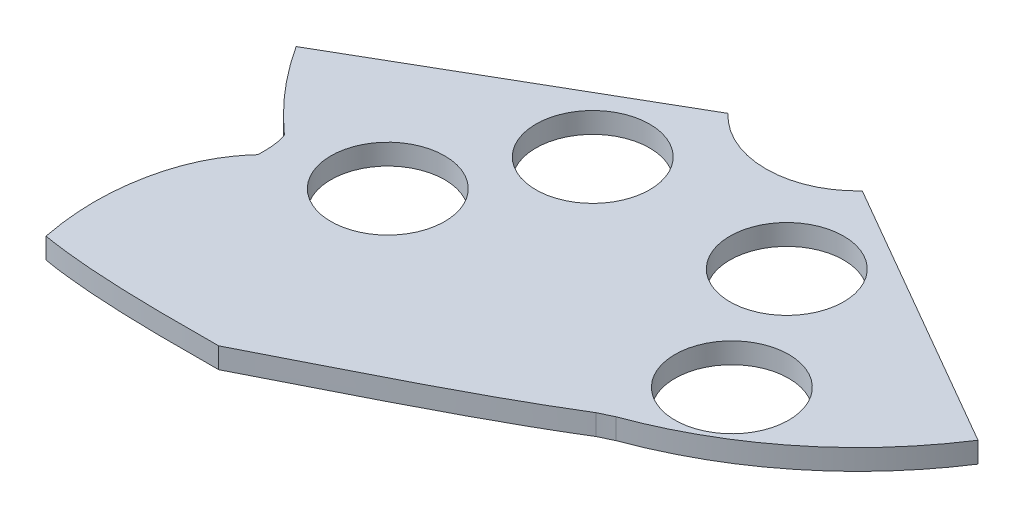
ISO-10303-21;
HEADER;
FILE_DESCRIPTION(('STEP AP214'),'2;1');
FILE_NAME('part.step','',(''),(''),'','','');
FILE_SCHEMA(('AUTOMOTIVE_DESIGN { 1 0 10303 214 1 1 1 1 }'));
ENDSEC;
DATA;
#1=APPLICATION_CONTEXT('core data for automotive mechanical design processes');
#2=APPLICATION_PROTOCOL_DEFINITION('international standard','automotive_design',2000,#1);
#3=PRODUCT_CONTEXT('',#1,'mechanical');
#4=PRODUCT('Part','Part','',(#3));
#5=PRODUCT_RELATED_PRODUCT_CATEGORY('part','',(#4));
#6=PRODUCT_DEFINITION_FORMATION('','',#4);
#7=PRODUCT_DEFINITION_CONTEXT('part definition',#1,'design');
#8=PRODUCT_DEFINITION('design','',#6,#7);
#9=PRODUCT_DEFINITION_SHAPE('','',#8);
#10=(LENGTH_UNIT() NAMED_UNIT(*) SI_UNIT(.MILLI.,.METRE.));
#11=(NAMED_UNIT(*) PLANE_ANGLE_UNIT() SI_UNIT($,.RADIAN.));
#12=(NAMED_UNIT(*) SI_UNIT($,.STERADIAN.) SOLID_ANGLE_UNIT());
#13=UNCERTAINTY_MEASURE_WITH_UNIT(LENGTH_MEASURE(1.E-05),#10,'distance_accuracy_value','');
#14=(GEOMETRIC_REPRESENTATION_CONTEXT(3) GLOBAL_UNCERTAINTY_ASSIGNED_CONTEXT((#13)) GLOBAL_UNIT_ASSIGNED_CONTEXT((#10,
#11,#12)) REPRESENTATION_CONTEXT('',''));
#15=CARTESIAN_POINT('',(0.,0.,0.));
#16=DIRECTION('',(0.,0.,1.));
#17=DIRECTION('',(1.,0.,0.));
#18=AXIS2_PLACEMENT_3D('',#15,#16,#17);
#19=CARTESIAN_POINT('',(-59.5908958473994,-99.736,51.0999248813994));
#20=DIRECTION('',(0.,-1.,0.));
#21=DIRECTION('',(0.,0.,-1.));
#22=AXIS2_PLACEMENT_3D('',#19,#20,#21);
#23=PLANE('',#22);
#24=CARTESIAN_POINT('',(18.75,-99.736,32.476));
#25=DIRECTION('',(0.,-1.,0.));
#26=DIRECTION('',(0.,0.,-1.));
#27=AXIS2_PLACEMENT_3D('',#24,#25,#26);
#28=CIRCLE('',#27,10.999845998306);
#29=CARTESIAN_POINT('',(18.75,-99.736,21.476154001694));
#30=VERTEX_POINT('',#29);
#31=EDGE_CURVE('E441',#30,#30,#28,.T.);
#32=ORIENTED_EDGE('',*,*,#31,.F.);
#33=EDGE_LOOP('',(#32));
#34=FACE_BOUND('',#33,.T.);
#35=CARTESIAN_POINT('',(-33.25,-99.736,57.591));
#36=DIRECTION('',(0.,-1.,0.));
#37=DIRECTION('',(0.,0.,-1.));
#38=AXIS2_PLACEMENT_3D('',#35,#36,#37);
#39=CIRCLE('',#38,10.999845998306);
#40=CARTESIAN_POINT('',(-33.25,-99.736,46.591154001694));
#41=VERTEX_POINT('',#40);
#42=EDGE_CURVE('E422',#41,#41,#39,.T.);
#43=ORIENTED_EDGE('',*,*,#42,.F.);
#44=EDGE_LOOP('',(#43));
#45=FACE_BOUND('',#44,.T.);
#46=CARTESIAN_POINT('',(-65.8942438215737,-99.736,42.6629141284688));
#47=CARTESIAN_POINT('',(-63.9840039596371,-99.736,45.6122875914085));
#48=CARTESIAN_POINT('',(-61.8778196203562,-99.736,48.4335551152774));
#49=CARTESIAN_POINT('',(-57.3039784403234,-99.736,53.7662872254148));
#50=CARTESIAN_POINT('',(-54.8369437876609,-99.736,56.2801089870337));
#51=CARTESIAN_POINT('',(-52.2139292092429,-99.736,58.6170428831987));
#52=B_SPLINE_CURVE_WITH_KNOTS('',3,(#46,#47,#48,#49,#50,#51),.UNSPECIFIED.,.F.,.F.,(4,2,4),
(1.39179995728433E-06,0.500001391799957,1.),.UNSPECIFIED.);
#53=CARTESIAN_POINT('',(-52.2139292141759,-99.736,58.6170428887357));
#54=VERTEX_POINT('',#53);
#55=CARTESIAN_POINT('',(-65.8942438215737,-99.736,42.6629141284688));
#56=VERTEX_POINT('',#55);
#57=EDGE_CURVE('E378',#54,#56,#52,.F.);
#58=ORIENTED_EDGE('',*,*,#57,.T.);
#59=DIRECTION('',(0.866025113443952,0.,-0.500000502884137));
#60=VECTOR('',#59,1.);
#61=CARTESIAN_POINT('',(-65.8942438215737,-99.736,42.6629141284688));
#62=LINE('',#61,#60);
#63=CARTESIAN_POINT('',(-12.9766531358799,-99.736,12.1108879302399));
#64=VERTEX_POINT('',#63);
#65=EDGE_CURVE('E103',#56,#64,#62,.T.);
#66=ORIENTED_EDGE('',*,*,#65,.T.);
#67=CARTESIAN_POINT('',(0.,-99.736,0.));
#68=DIRECTION('',(0.,1.,0.));
#69=DIRECTION('',(0.,0.,-1.));
#70=AXIS2_PLACEMENT_3D('',#67,#68,#69);
#71=CIRCLE('',#70,17.7501305084715);
#72=CARTESIAN_POINT('',(12.9766531358511,-99.736,12.1108879302707));
#73=VERTEX_POINT('',#72);
#74=EDGE_CURVE('E272',#64,#73,#71,.T.);
#75=ORIENTED_EDGE('',*,*,#74,.T.);
#76=DIRECTION('',(0.866025113442765,0.,0.500000502886193));
#77=VECTOR('',#76,1.);
#78=CARTESIAN_POINT('',(12.9766531358511,-99.736,12.1108879302707));
#79=LINE('',#78,#77);
#80=CARTESIAN_POINT('',(65.8946490574718,-99.736,42.6631480920524));
#81=VERTEX_POINT('',#80);
#82=EDGE_CURVE('E249',#73,#81,#79,.T.);
#83=ORIENTED_EDGE('',*,*,#82,.T.);
#84=CARTESIAN_POINT('',(26.9623093718119,-99.736,73.7247949113876));
#85=CARTESIAN_POINT('',(30.9290383355364,-99.736,72.2744827832804));
#86=CARTESIAN_POINT('',(34.774905800181,-99.736,70.5032364463664));
#87=CARTESIAN_POINT('',(40.3009419819919,-99.736,67.3976495532651));
#88=CARTESIAN_POINT('',(42.0999932076313,-99.736,66.2898834281091));
#89=CARTESIAN_POINT('',(45.6012748301672,-99.736,63.9313792779829));
#90=CARTESIAN_POINT('',(47.3055701881919,-99.736,62.6798674808376));
#91=CARTESIAN_POINT('',(52.2596052139985,-99.736,58.7281530850985));
#92=CARTESIAN_POINT('',(55.3477771990305,-99.736,55.8285573460401));
#93=CARTESIAN_POINT('',(61.0180676571082,-99.736,49.5686140032875));
#94=CARTESIAN_POINT('',(63.5993686540043,-99.736,46.2085982513747));
#95=CARTESIAN_POINT('',(65.8946490574718,-99.736,42.6631480920524));
#96=B_SPLINE_CURVE_WITH_KNOTS('',3,(#84,#85,#86,#87,#88,#89,#90,#91,#92,#93,#94,#95),
.UNSPECIFIED.,.F.,.F.,(4,2,2,2,2,4),(0.,0.250000000000001,0.375,0.5,0.75,1.),.UNSPECIFIED.);
#97=CARTESIAN_POINT('',(26.9623093718119,-99.736,73.7247949113876));
#98=VERTEX_POINT('',#97);
#99=EDGE_CURVE('E244',#81,#98,#96,.F.);
#100=ORIENTED_EDGE('',*,*,#99,.T.);
#101=CARTESIAN_POINT('',(24.3635474099013,-99.736,74.9703640030378));
#102=CARTESIAN_POINT('',(24.504895258871,-99.736,74.8957933395371));
#103=CARTESIAN_POINT('',(24.7885054477501,-99.736,74.7461721234199));
#104=CARTESIAN_POINT('',(25.2202238778301,-99.736,74.5299119746692));
#105=CARTESIAN_POINT('',(25.7310374353915,-99.736,74.2826548361469));
#106=CARTESIAN_POINT('',(26.311602051326,-99.736,74.0127331890676));
#107=CARTESIAN_POINT('',(26.7487449389081,-99.736,73.8192972281379));
#108=CARTESIAN_POINT('',(26.9623086079489,-99.736,73.7247951906713));
#109=B_SPLINE_CURVE_WITH_KNOTS('',3,(#101,#102,#103,#104,#105,#106,#107,#108),.UNSPECIFIED.,.F.,
.F.,(4,1,1,1,1,4),(0.,0.166302308320952,0.333679330924301,0.502441424578362,0.756863165490183,
0.999887722188058),.UNSPECIFIED.);
#110=CARTESIAN_POINT('',(24.3635474099013,-99.736,74.9703640030378));
#111=VERTEX_POINT('',#110);
#112=EDGE_CURVE('E321',#98,#111,#109,.F.);
#113=ORIENTED_EDGE('',*,*,#112,.T.);
#114=CARTESIAN_POINT('',(-23.2826883139584,-99.736,100.239789279672));
#115=CARTESIAN_POINT('',(-22.4064800124137,-99.736,99.7924462503326));
#116=CARTESIAN_POINT('',(-20.6372377731749,-99.736,98.8891699614171));
#117=CARTESIAN_POINT('',(-15.4675726686189,-99.736,96.2742080454189));
#118=CARTESIAN_POINT('',(-7.71690180073564,-99.736,92.3907939135846));
#119=CARTESIAN_POINT('',(0.69025250496672,-99.736,88.1133323119624));
#120=CARTESIAN_POINT('',(7.50120204387223,-99.736,84.5367741734257));
#121=CARTESIAN_POINT('',(12.5650779158545,-99.736,81.8042095762084));
#122=CARTESIAN_POINT('',(17.7115577630885,-99.736,78.9204102346819));
#123=CARTESIAN_POINT('',(21.3026007906839,-99.736,76.8187696134885));
#124=CARTESIAN_POINT('',(23.5091899984885,-99.736,75.4903709563967));
#125=CARTESIAN_POINT('',(24.0767304185092,-99.736,75.1449357918904));
#126=CARTESIAN_POINT('',(24.3635474098919,-99.736,74.9703640030223));
#127=B_SPLINE_CURVE_WITH_KNOTS('',3,(#114,#115,#116,#117,#118,#119,#120,#121,#122,#123,#124,
#125,#126),.UNSPECIFIED.,.F.,.F.,(4,1,1,1,1,1,1,1,1,1,4),(-4.3701811903718E-06,
0.0547045458955122,0.110464025307909,0.322165712591621,0.536796962772431,0.635003948080193,
0.749962478870649,0.856771583074697,0.96305276758821,0.981328042949346,1.00000000000009),.UNSPECIFIED.);
#128=CARTESIAN_POINT('',(-23.2826883139584,-99.736,100.239789279672));
#129=VERTEX_POINT('',#128);
#130=EDGE_CURVE('E129',#111,#129,#127,.F.);
#131=ORIENTED_EDGE('',*,*,#130,.T.);
#132=CARTESIAN_POINT('',(-1669.3169944597,-99.736,1229.30718692422));
#133=CARTESIAN_POINT('',(2148.0173222506,-99.736,-1018.92386345187));
#134=CARTESIAN_POINT('',(-2164.91270202674,-99.736,1202.26997164792));
#135=CARTESIAN_POINT('',(1624.65400079232,-99.736,-978.564595621602));
#136=B_SPLINE_CURVE_WITH_KNOTS('',3,(#132,#133,#134,#135),.UNSPECIFIED.,.F.,.F.,(4,4),
(-9.92121066633461,9.34593164522102),.UNSPECIFIED.);
#137=CARTESIAN_POINT('',(-58.3328550829168,-99.736,98.568820578961));
#138=VERTEX_POINT('',#137);
#139=EDGE_CURVE('E122',#129,#138,#136,.T.);
#140=ORIENTED_EDGE('',*,*,#139,.T.);
#141=CARTESIAN_POINT('',(-51.4906928753883,-99.736,64.4589689277213));
#142=CARTESIAN_POINT('',(-51.711723307029,-99.736,64.7046850204382));
#143=CARTESIAN_POINT('',(-52.1516151834694,-99.736,65.1937054728768));
#144=CARTESIAN_POINT('',(-52.7723949504336,-99.736,65.9552520868977));
#145=CARTESIAN_POINT('',(-53.3609545073442,-99.736,66.7313423761301));
#146=CARTESIAN_POINT('',(-53.9157163309975,-99.736,67.5235939872376));
#147=CARTESIAN_POINT('',(-54.7918608211576,-99.736,68.876753614916));
#148=CARTESIAN_POINT('',(-55.8834594583203,-99.736,70.8638801995351));
#149=CARTESIAN_POINT('',(-57.0165943997224,-99.736,73.5315666341852));
#150=CARTESIAN_POINT('',(-57.9094867293355,-99.736,76.3017585118482));
#151=CARTESIAN_POINT('',(-58.5775393006056,-99.736,79.1271095885574));
#152=CARTESIAN_POINT('',(-59.0517620475631,-99.736,82.0106522481691));
#153=CARTESIAN_POINT('',(-59.3372874543469,-99.736,84.8919464637603));
#154=CARTESIAN_POINT('',(-59.4406913737221,-99.736,87.7685229035063));
#155=CARTESIAN_POINT('',(-59.3718138200478,-99.736,90.6212286463738));
#156=CARTESIAN_POINT('',(-59.1789836962622,-99.736,92.9844425201729));
#157=CARTESIAN_POINT('',(-58.9503668066364,-99.736,94.8648753989335));
#158=CARTESIAN_POINT('',(-58.7711853577117,-99.736,96.0855047846796));
#159=CARTESIAN_POINT('',(-58.6047431822294,-99.736,97.0912677796519));
#160=CARTESIAN_POINT('',(-58.4687760228228,-99.736,97.8574149315629));
#161=CARTESIAN_POINT('',(-58.3764860521202,-99.736,98.3404575477575));
#162=CARTESIAN_POINT('',(-58.3328550830203,-99.736,98.5688205789807));
#163=B_SPLINE_CURVE_WITH_KNOTS('',3,(#141,#142,#143,#144,#145,#146,#147,#148,#149,#150,#151,
#152,#153,#154,#155,#156,#157,#158,#159,#160,#161,#162),.UNSPECIFIED.,.F.,.F.,(4,1,1,1,1,1,1,1,
1,1,1,1,1,1,1,1,1,1,1,4),(-1.10533804331681E-12,0.0275012446218071,0.0547325859144433,
0.0817350649508025,0.108546201435326,0.135200513378319,0.215871144837617,0.296834029909777,
0.376050589025834,0.457805083877822,0.538220215626806,0.619074716839881,0.698599870823023,
0.777615725570406,0.856414831682729,0.895814886594267,0.93524678276134,0.959074415855892,
0.980652341517551,1.00000057672125),.UNSPECIFIED.);
#164=CARTESIAN_POINT('',(-51.4906928753883,-99.736,64.4589689277213));
#165=VERTEX_POINT('',#164);
#166=EDGE_CURVE('E126',#138,#165,#163,.F.);
#167=ORIENTED_EDGE('',*,*,#166,.T.);
#168=CARTESIAN_POINT('',(-52.2139292141759,-99.736,58.6170428887357));
#169=CARTESIAN_POINT('',(-52.185700803631,-99.736,58.6919344999885));
#170=CARTESIAN_POINT('',(-52.1296231499672,-99.736,58.8407117693101));
#171=CARTESIAN_POINT('',(-52.0534037189861,-99.736,59.0650498919511));
#172=CARTESIAN_POINT('',(-51.9695236186869,-99.736,59.3327056988002));
#173=CARTESIAN_POINT('',(-51.8820387495496,-99.736,59.6478085092204));
#174=CARTESIAN_POINT('',(-51.7680242428427,-99.736,60.1272476442796));
#175=CARTESIAN_POINT('',(-51.6554178661394,-99.736,60.7426858067751));
#176=CARTESIAN_POINT('',(-51.5346083508011,-99.736,61.7360748328224));
#177=CARTESIAN_POINT('',(-51.4854390608135,-99.736,62.7429515755013));
#178=CARTESIAN_POINT('',(-51.4795640266868,-99.736,63.6157889502724));
#179=CARTESIAN_POINT('',(-51.4834906588835,-99.736,64.1044575689541));
#180=CARTESIAN_POINT('',(-51.4883312545796,-99.7359999999999,64.3427256906522));
#181=CARTESIAN_POINT('',(-51.4906928753883,-99.7359999999999,64.4589689277213));
#182=B_SPLINE_CURVE_WITH_KNOTS('',3,(#168,#169,#170,#171,#172,#173,#174,#175,#176,#177,#178,
#179,#180,#181),.UNSPECIFIED.,.F.,.F.,(4,1,1,1,1,1,1,1,1,1,1,4),(4.41350721547273E-06,
0.0405296757742124,0.08051059781494,0.119959931369552,0.182552622210914,0.246058623212267,
0.369457252362463,0.499123697640981,0.752552578421829,0.879323211881176,0.941125734758046,1.),.UNSPECIFIED.);
#183=EDGE_CURVE('E51',#165,#54,#182,.F.);
#184=ORIENTED_EDGE('',*,*,#183,.T.);
#185=EDGE_LOOP('',(#58,#66,#75,#83,#100,#113,#131,#140,#167,#184));
#186=FACE_BOUND('',#185,.T.);
#187=CARTESIAN_POINT('',(33.25,-99.736,57.591));
#188=DIRECTION('',(0.,-1.,0.));
#189=DIRECTION('',(0.,0.,-1.));
#190=AXIS2_PLACEMENT_3D('',#187,#188,#189);
#191=CIRCLE('',#190,10.999845998306);
#192=CARTESIAN_POINT('',(33.25,-99.736,46.591154001694));
#193=VERTEX_POINT('',#192);
#194=EDGE_CURVE('E429',#193,#193,#191,.T.);
#195=ORIENTED_EDGE('',*,*,#194,.F.);
#196=EDGE_LOOP('',(#195));
#197=FACE_BOUND('',#196,.T.);
#198=CARTESIAN_POINT('',(-18.75,-99.736,32.476));
#199=DIRECTION('',(0.,-1.,0.));
#200=DIRECTION('',(0.,0.,-1.));
#201=AXIS2_PLACEMENT_3D('',#198,#199,#200);
#202=CIRCLE('',#201,10.999845998306);
#203=CARTESIAN_POINT('',(-18.75,-99.736,21.476154001694));
#204=VERTEX_POINT('',#203);
#205=EDGE_CURVE('E447',#204,#204,#202,.T.);
#206=ORIENTED_EDGE('',*,*,#205,.F.);
#207=EDGE_LOOP('',(#206));
#208=FACE_BOUND('',#207,.T.);
#209=ADVANCED_FACE('F30',(#34,#45,#186,#197,#208),#23,.T.);
#210=CARTESIAN_POINT('',(-59.5908958473994,-95.736,51.0999248813994));
#211=DIRECTION('',(0.,-1.,0.));
#212=DIRECTION('',(0.,0.,-1.));
#213=AXIS2_PLACEMENT_3D('',#210,#211,#212);
#214=PLANE('',#213);
#215=CARTESIAN_POINT('',(18.75,-95.736,32.476));
#216=DIRECTION('',(0.,-1.,0.));
#217=DIRECTION('',(0.,0.,-1.));
#218=AXIS2_PLACEMENT_3D('',#215,#216,#217);
#219=CIRCLE('',#218,10.999845998306);
#220=CARTESIAN_POINT('',(18.75,-95.736,21.476154001694));
#221=VERTEX_POINT('',#220);
#222=EDGE_CURVE('E444',#221,#221,#219,.T.);
#223=ORIENTED_EDGE('',*,*,#222,.T.);
#224=EDGE_LOOP('',(#223));
#225=FACE_BOUND('',#224,.T.);
#226=CARTESIAN_POINT('',(-33.25,-95.736,57.591));
#227=DIRECTION('',(0.,-1.,0.));
#228=DIRECTION('',(0.,0.,-1.));
#229=AXIS2_PLACEMENT_3D('',#226,#227,#228);
#230=CIRCLE('',#229,10.999845998306);
#231=CARTESIAN_POINT('',(-33.25,-95.736,46.591154001694));
#232=VERTEX_POINT('',#231);
#233=EDGE_CURVE('E424',#232,#232,#230,.T.);
#234=ORIENTED_EDGE('',*,*,#233,.T.);
#235=EDGE_LOOP('',(#234));
#236=FACE_BOUND('',#235,.T.);
#237=CARTESIAN_POINT('',(-52.2139292092429,-95.736,58.6170428831987));
#238=CARTESIAN_POINT('',(-54.8369437876609,-95.736,56.2801089870337));
#239=CARTESIAN_POINT('',(-57.3039784403234,-95.736,53.7662872254148));
#240=CARTESIAN_POINT('',(-61.8778196203562,-95.736,48.4335551152774));
#241=CARTESIAN_POINT('',(-63.9840039596371,-95.736,45.6122875914085));
#242=CARTESIAN_POINT('',(-65.8942438215737,-95.736,42.6629141284688));
#243=B_SPLINE_CURVE_WITH_KNOTS('',3,(#237,#238,#239,#240,#241,#242),.UNSPECIFIED.,.F.,.F.,(4,2,
4),(1.39179995734587E-06,0.5,1.),.UNSPECIFIED.);
#244=CARTESIAN_POINT('',(-52.2139292141759,-95.736,58.6170428887357));
#245=VERTEX_POINT('',#244);
#246=CARTESIAN_POINT('',(-65.8942438215737,-95.736,42.6629141284688));
#247=VERTEX_POINT('',#246);
#248=EDGE_CURVE('E405',#245,#247,#243,.T.);
#249=ORIENTED_EDGE('',*,*,#248,.F.);
#250=CARTESIAN_POINT('',(-51.4906928753883,-95.7360000000001,64.4589689277213));
#251=CARTESIAN_POINT('',(-51.4883312545796,-95.7360000000001,64.3427256906522));
#252=CARTESIAN_POINT('',(-51.4834906588835,-95.7360000000001,64.1044575689541));
#253=CARTESIAN_POINT('',(-51.4795640266868,-95.7360000000001,63.6157889502724));
#254=CARTESIAN_POINT('',(-51.4854390608135,-95.7360000000001,62.7429515755013));
#255=CARTESIAN_POINT('',(-51.5346083508011,-95.7360000000001,61.7360748328224));
#256=CARTESIAN_POINT('',(-51.6554178661394,-95.7360000000001,60.7426858067751));
#257=CARTESIAN_POINT('',(-51.7680242428427,-95.7360000000001,60.1272476442796));
#258=CARTESIAN_POINT('',(-51.8820387495496,-95.7360000000001,59.6478085092204));
#259=CARTESIAN_POINT('',(-51.9695236186869,-95.7360000000001,59.3327056988002));
#260=CARTESIAN_POINT('',(-52.0534037189861,-95.7360000000001,59.0650498919511));
#261=CARTESIAN_POINT('',(-52.1296231499672,-95.7360000000001,58.8407117693101));
#262=CARTESIAN_POINT('',(-52.185700803631,-95.7360000000001,58.6919344999885));
#263=CARTESIAN_POINT('',(-52.2139292141759,-95.7360000000001,58.6170428887357));
#264=B_SPLINE_CURVE_WITH_KNOTS('',3,(#250,#251,#252,#253,#254,#255,#256,#257,#258,#259,#260,
#261,#262,#263),.UNSPECIFIED.,.F.,.F.,(4,1,1,1,1,1,1,1,1,1,1,4),(4.4135072154258E-06,
0.05887867874917,0.12068120162604,0.247451835085386,0.500880715866235,0.630547161144752,
0.753945790294948,0.817451791296302,0.880044482137663,0.919493815692276,0.959474737733003,1.),.UNSPECIFIED.);
#265=CARTESIAN_POINT('',(-51.4906928753883,-95.736,64.4589689277213));
#266=VERTEX_POINT('',#265);
#267=EDGE_CURVE('E94',#266,#245,#264,.T.);
#268=ORIENTED_EDGE('',*,*,#267,.F.);
#269=CARTESIAN_POINT('',(-58.3328550830203,-95.736,98.5688205789807));
#270=CARTESIAN_POINT('',(-58.3764860521202,-95.736,98.3404575477575));
#271=CARTESIAN_POINT('',(-58.4687760228228,-95.736,97.8574149315629));
#272=CARTESIAN_POINT('',(-58.6047431822294,-95.736,97.0912677796519));
#273=CARTESIAN_POINT('',(-58.7711853577117,-95.736,96.0855047846796));
#274=CARTESIAN_POINT('',(-58.9503668066364,-95.736,94.8648753989335));
#275=CARTESIAN_POINT('',(-59.1789836962622,-95.736,92.9844425201729));
#276=CARTESIAN_POINT('',(-59.3718138200478,-95.736,90.6212286463738));
#277=CARTESIAN_POINT('',(-59.4406913737221,-95.736,87.7685229035063));
#278=CARTESIAN_POINT('',(-59.3372874543469,-95.736,84.8919464637603));
#279=CARTESIAN_POINT('',(-59.0517620475631,-95.736,82.0106522481691));
#280=CARTESIAN_POINT('',(-58.5775393006056,-95.736,79.1271095885574));
#281=CARTESIAN_POINT('',(-57.9094867293355,-95.736,76.3017585118482));
#282=CARTESIAN_POINT('',(-57.0165943997224,-95.736,73.5315666341852));
#283=CARTESIAN_POINT('',(-55.8834594583203,-95.736,70.8638801995351));
#284=CARTESIAN_POINT('',(-54.7918608211576,-95.736,68.876753614916));
#285=CARTESIAN_POINT('',(-53.9157163309975,-95.736,67.5235939872376));
#286=CARTESIAN_POINT('',(-53.3609545073442,-95.736,66.7313423761301));
#287=CARTESIAN_POINT('',(-52.7723949504336,-95.736,65.9552520868977));
#288=CARTESIAN_POINT('',(-52.1516151834694,-95.736,65.1937054728768));
#289=CARTESIAN_POINT('',(-51.711723307029,-95.736,64.7046850204382));
#290=CARTESIAN_POINT('',(-51.4906928753883,-95.736,64.4589689277213));
#291=B_SPLINE_CURVE_WITH_KNOTS('',3,(#269,#270,#271,#272,#273,#274,#275,#276,#277,#278,#279,
#280,#281,#282,#283,#284,#285,#286,#287,#288,#289,#290),.UNSPECIFIED.,.F.,.F.,(4,1,1,1,1,1,1,1,
1,1,1,1,1,1,1,1,1,1,1,4),(-1.10525326897802E-12,0.0193482352025983,0.0409261608642563,
0.0647537939588088,0.104185690125882,0.14358574503742,0.222384851149743,0.301400705897126,
0.380925859880268,0.461780361093343,0.542195492842326,0.623949987694314,0.703166546810372,
0.784129431882532,0.86480006334183,0.891454375284823,0.918265511769346,0.945267990805705,
0.972499332098342,1.00000057672125),.UNSPECIFIED.);
#292=CARTESIAN_POINT('',(-58.3328550829168,-95.736,98.568820578961));
#293=VERTEX_POINT('',#292);
#294=EDGE_CURVE('E87',#293,#266,#291,.T.);
#295=ORIENTED_EDGE('',*,*,#294,.F.);
#296=CARTESIAN_POINT('',(-1669.3169944597,-95.736,1229.30718692422));
#297=CARTESIAN_POINT('',(2148.0173222506,-95.736,-1018.92386345187));
#298=CARTESIAN_POINT('',(-2164.91270202674,-95.736,1202.26997164792));
#299=CARTESIAN_POINT('',(1624.65400079232,-95.736,-978.564595621602));
#300=B_SPLINE_CURVE_WITH_KNOTS('',3,(#296,#297,#298,#299),.UNSPECIFIED.,.F.,.F.,(4,4),
(-9.92121066633461,9.34593164522102),.UNSPECIFIED.);
#301=CARTESIAN_POINT('',(-23.2826883139584,-95.736,100.239789279672));
#302=VERTEX_POINT('',#301);
#303=EDGE_CURVE('E138',#302,#293,#300,.T.);
#304=ORIENTED_EDGE('',*,*,#303,.F.);
#305=CARTESIAN_POINT('',(24.3635474098919,-95.736,74.9703640030223));
#306=CARTESIAN_POINT('',(24.0767304185092,-95.736,75.1449357918904));
#307=CARTESIAN_POINT('',(23.5091899984885,-95.736,75.4903709563967));
#308=CARTESIAN_POINT('',(21.3026007906839,-95.736,76.8187696134885));
#309=CARTESIAN_POINT('',(17.7115577630885,-95.736,78.9204102346819));
#310=CARTESIAN_POINT('',(12.5650779158545,-95.736,81.8042095762084));
#311=CARTESIAN_POINT('',(7.50120204387223,-95.736,84.5367741734257));
#312=CARTESIAN_POINT('',(0.69025250496672,-95.736,88.1133323119624));
#313=CARTESIAN_POINT('',(-7.71690180073564,-95.736,92.3907939135846));
#314=CARTESIAN_POINT('',(-15.4675726686189,-95.736,96.2742080454189));
#315=CARTESIAN_POINT('',(-20.6372377731749,-95.736,98.8891699614171));
#316=CARTESIAN_POINT('',(-22.4064800124137,-95.736,99.7924462503326));
#317=CARTESIAN_POINT('',(-23.2826883139584,-95.736,100.239789279672));
#318=B_SPLINE_CURVE_WITH_KNOTS('',3,(#305,#306,#307,#308,#309,#310,#311,#312,#313,#314,#315,
#316,#317),.UNSPECIFIED.,.F.,.F.,(4,1,1,1,1,1,1,1,1,1,4),(-4.37018119038239E-06,
0.0186675868695492,0.0369428622306848,0.143224046744198,0.250033150948246,0.364991681738702,
0.463198667046464,0.677829917227274,0.889531604510986,0.945291083923383,1.00000000000009),.UNSPECIFIED.);
#319=CARTESIAN_POINT('',(24.3635474099013,-95.736,74.9703640030378));
#320=VERTEX_POINT('',#319);
#321=EDGE_CURVE('E312',#320,#302,#318,.T.);
#322=ORIENTED_EDGE('',*,*,#321,.F.);
#323=CARTESIAN_POINT('',(26.9623086079489,-95.736,73.7247951906713));
#324=CARTESIAN_POINT('',(26.7487449389081,-95.736,73.8192972281379));
#325=CARTESIAN_POINT('',(26.311602051326,-95.736,74.0127331890676));
#326=CARTESIAN_POINT('',(25.7310374353915,-95.736,74.2826548361469));
#327=CARTESIAN_POINT('',(25.2202238778301,-95.736,74.5299119746692));
#328=CARTESIAN_POINT('',(24.7885054477501,-95.736,74.7461721234199));
#329=CARTESIAN_POINT('',(24.504895258871,-95.736,74.8957933395371));
#330=CARTESIAN_POINT('',(24.3635474099013,-95.736,74.9703640030378));
#331=B_SPLINE_CURVE_WITH_KNOTS('',3,(#323,#324,#325,#326,#327,#328,#329,#330),.UNSPECIFIED.,.F.,
.F.,(4,1,1,1,1,4),(0.,0.243024556697875,0.497446297609696,0.666208391263756,0.833585413867105,
0.999887722188058),.UNSPECIFIED.);
#332=CARTESIAN_POINT('',(26.9623093718119,-95.736,73.7247949113876));
#333=VERTEX_POINT('',#332);
#334=EDGE_CURVE('E327',#333,#320,#331,.T.);
#335=ORIENTED_EDGE('',*,*,#334,.F.);
#336=CARTESIAN_POINT('',(65.8946490574718,-95.736,42.6631480920524));
#337=CARTESIAN_POINT('',(63.5993686540043,-95.736,46.2085982513747));
#338=CARTESIAN_POINT('',(61.0180676571082,-95.736,49.5686140032875));
#339=CARTESIAN_POINT('',(55.3477771990305,-95.736,55.8285573460401));
#340=CARTESIAN_POINT('',(52.2596052139985,-95.736,58.7281530850985));
#341=CARTESIAN_POINT('',(47.3055701881919,-95.736,62.6798674808376));
#342=CARTESIAN_POINT('',(45.6012748301672,-95.736,63.9313792779829));
#343=CARTESIAN_POINT('',(42.0999932076313,-95.736,66.2898834281091));
#344=CARTESIAN_POINT('',(40.3009419819919,-95.736,67.3976495532651));
#345=CARTESIAN_POINT('',(34.774905800181,-95.736,70.5032364463664));
#346=CARTESIAN_POINT('',(30.9290383355364,-95.736,72.2744827832804));
#347=CARTESIAN_POINT('',(26.9623093718119,-95.736,73.7247949113876));
#348=B_SPLINE_CURVE_WITH_KNOTS('',3,(#336,#337,#338,#339,#340,#341,#342,#343,#344,#345,#346,
#347),.UNSPECIFIED.,.F.,.F.,(4,2,2,2,2,4),(0.,0.25,0.5,0.625,0.749999999999999,1.),.UNSPECIFIED.);
#349=CARTESIAN_POINT('',(65.8946490574718,-95.736,42.6631480920524));
#350=VERTEX_POINT('',#349);
#351=EDGE_CURVE('E363',#350,#333,#348,.T.);
#352=ORIENTED_EDGE('',*,*,#351,.F.);
#353=DIRECTION('',(0.866025113442765,0.,0.500000502886193));
#354=VECTOR('',#353,1.);
#355=CARTESIAN_POINT('',(12.9766531358511,-95.736,12.1108879302707));
#356=LINE('',#355,#354);
#357=CARTESIAN_POINT('',(12.9766531358511,-95.736,12.1108879302707));
#358=VERTEX_POINT('',#357);
#359=EDGE_CURVE('E188',#358,#350,#356,.T.);
#360=ORIENTED_EDGE('',*,*,#359,.F.);
#361=CARTESIAN_POINT('',(0.,-95.736,0.));
#362=DIRECTION('',(0.,1.,0.));
#363=DIRECTION('',(0.,0.,-1.));
#364=AXIS2_PLACEMENT_3D('',#361,#362,#363);
#365=CIRCLE('',#364,17.7501305084715);
#366=CARTESIAN_POINT('',(-12.9766531358799,-95.736,12.1108879302399));
#367=VERTEX_POINT('',#366);
#368=EDGE_CURVE('E183',#367,#358,#365,.T.);
#369=ORIENTED_EDGE('',*,*,#368,.F.);
#370=DIRECTION('',(0.866025113443952,0.,-0.500000502884137));
#371=VECTOR('',#370,1.);
#372=CARTESIAN_POINT('',(-65.8942438215737,-95.736,42.6629141284688));
#373=LINE('',#372,#371);
#374=EDGE_CURVE('E189',#247,#367,#373,.T.);
#375=ORIENTED_EDGE('',*,*,#374,.F.);
#376=EDGE_LOOP('',(#249,#268,#295,#304,#322,#335,#352,#360,#369,#375));
#377=FACE_BOUND('',#376,.T.);
#378=CARTESIAN_POINT('',(33.25,-95.736,57.591));
#379=DIRECTION('',(0.,-1.,0.));
#380=DIRECTION('',(0.,0.,-1.));
#381=AXIS2_PLACEMENT_3D('',#378,#379,#380);
#382=CIRCLE('',#381,10.999845998306);
#383=CARTESIAN_POINT('',(33.25,-95.736,46.591154001694));
#384=VERTEX_POINT('',#383);
#385=EDGE_CURVE('E432',#384,#384,#382,.T.);
#386=ORIENTED_EDGE('',*,*,#385,.T.);
#387=EDGE_LOOP('',(#386));
#388=FACE_BOUND('',#387,.T.);
#389=CARTESIAN_POINT('',(-18.75,-95.736,32.476));
#390=DIRECTION('',(0.,-1.,0.));
#391=DIRECTION('',(0.,0.,-1.));
#392=AXIS2_PLACEMENT_3D('',#389,#390,#391);
#393=CIRCLE('',#392,10.999845998306);
#394=CARTESIAN_POINT('',(-18.75,-95.736,21.476154001694));
#395=VERTEX_POINT('',#394);
#396=EDGE_CURVE('E450',#395,#395,#393,.T.);
#397=ORIENTED_EDGE('',*,*,#396,.T.);
#398=EDGE_LOOP('',(#397));
#399=FACE_BOUND('',#398,.T.);
#400=ADVANCED_FACE('F208',(#225,#236,#377,#388,#399),#214,.F.);
#401=CARTESIAN_POINT('',(-52.2139073049089,-99.736,58.6170623985159));
#402=CARTESIAN_POINT('',(-54.8369300531463,-99.736,56.2801229820196));
#403=CARTESIAN_POINT('',(-57.3039720744426,-99.736,53.7662946475215));
#404=CARTESIAN_POINT('',(-61.8778196203562,-99.736,48.4335551152774));
#405=CARTESIAN_POINT('',(-63.9840039596371,-99.736,45.6122875914085));
#406=CARTESIAN_POINT('',(-65.8942438215737,-99.736,42.6629141284688));
#407=B_SPLINE_CURVE_WITH_KNOTS('',3,(#401,#402,#403,#404,#405,#406),.UNSPECIFIED.,.F.,.F.,(4,2,
4),(0.,0.5,1.),.UNSPECIFIED.);
#408=DIRECTION('',(0.,1.,0.));
#409=VECTOR('',#408,1.);
#410=SURFACE_OF_LINEAR_EXTRUSION('',#407,#409);
#411=ORIENTED_EDGE('',*,*,#248,.T.);
#412=DIRECTION('',(0.,1.,0.));
#413=VECTOR('',#412,1.);
#414=CARTESIAN_POINT('',(-65.8942438215737,-99.736,42.6629141284688));
#415=LINE('',#414,#413);
#416=EDGE_CURVE('E11',#56,#247,#415,.T.);
#417=ORIENTED_EDGE('',*,*,#416,.F.);
#418=ORIENTED_EDGE('',*,*,#57,.F.);
#419=DIRECTION('',(0.,1.,0.));
#420=VECTOR('',#419,1.);
#421=CARTESIAN_POINT('',(-52.2139292141759,-99.736,58.6170428887357));
#422=LINE('',#421,#420);
#423=EDGE_CURVE('E652',#54,#245,#422,.T.);
#424=ORIENTED_EDGE('',*,*,#423,.T.);
#425=EDGE_LOOP('',(#411,#417,#418,#424));
#426=FACE_BOUND('',#425,.T.);
#427=ADVANCED_FACE('F32',(#426),#410,.F.);
#428=CARTESIAN_POINT('',(-65.8942438215737,-99.736,42.6629141284688));
#429=DIRECTION('',(0.500000502884137,0.,0.866025113443952));
#430=DIRECTION('',(0.866025113443952,0.,-0.500000502884137));
#431=AXIS2_PLACEMENT_3D('',#428,#429,#430);
#432=PLANE('',#431);
#433=ORIENTED_EDGE('',*,*,#374,.T.);
#434=DIRECTION('',(0.,1.,0.));
#435=VECTOR('',#434,1.);
#436=CARTESIAN_POINT('',(-12.9766531358799,-99.736,12.1108879302399));
#437=LINE('',#436,#435);
#438=EDGE_CURVE('E42',#64,#367,#437,.T.);
#439=ORIENTED_EDGE('',*,*,#438,.F.);
#440=ORIENTED_EDGE('',*,*,#65,.F.);
#441=ORIENTED_EDGE('',*,*,#416,.T.);
#442=EDGE_LOOP('',(#433,#439,#440,#441));
#443=FACE_BOUND('',#442,.T.);
#444=ADVANCED_FACE('F469',(#443),#432,.F.);
#445=CARTESIAN_POINT('',(0.,-99.736,0.));
#446=DIRECTION('',(0.,1.,0.));
#447=DIRECTION('',(0.,0.,1.));
#448=AXIS2_PLACEMENT_3D('',#445,#446,#447);
#449=CYLINDRICAL_SURFACE('',#448,17.7501305084715);
#450=ORIENTED_EDGE('',*,*,#368,.T.);
#451=DIRECTION('',(0.,1.,0.));
#452=VECTOR('',#451,1.);
#453=CARTESIAN_POINT('',(12.9766531358511,-99.736,12.1108879302707));
#454=LINE('',#453,#452);
#455=EDGE_CURVE('E190',#73,#358,#454,.T.);
#456=ORIENTED_EDGE('',*,*,#455,.F.);
#457=ORIENTED_EDGE('',*,*,#74,.F.);
#458=ORIENTED_EDGE('',*,*,#438,.T.);
#459=EDGE_LOOP('',(#450,#456,#457,#458));
#460=FACE_BOUND('',#459,.T.);
#461=ADVANCED_FACE('F517',(#460),#449,.F.);
#462=CARTESIAN_POINT('',(12.9766531358511,-99.736,12.1108879302707));
#463=DIRECTION('',(-0.500000502886193,0.,0.866025113442765));
#464=DIRECTION('',(0.866025113442765,0.,0.500000502886193));
#465=AXIS2_PLACEMENT_3D('',#462,#463,#464);
#466=PLANE('',#465);
#467=ORIENTED_EDGE('',*,*,#359,.T.);
#468=DIRECTION('',(0.,1.,0.));
#469=VECTOR('',#468,1.);
#470=CARTESIAN_POINT('',(65.8946490574718,-99.736,42.6631480920524));
#471=LINE('',#470,#469);
#472=EDGE_CURVE('E193',#81,#350,#471,.T.);
#473=ORIENTED_EDGE('',*,*,#472,.F.);
#474=ORIENTED_EDGE('',*,*,#82,.F.);
#475=ORIENTED_EDGE('',*,*,#455,.T.);
#476=EDGE_LOOP('',(#467,#473,#474,#475));
#477=FACE_BOUND('',#476,.T.);
#478=ADVANCED_FACE('F263',(#477),#466,.F.);
#479=CARTESIAN_POINT('',(65.8946490574718,-99.736,42.6631480920524));
#480=CARTESIAN_POINT('',(63.5993686540043,-99.736,46.2085982513747));
#481=CARTESIAN_POINT('',(61.0180676571082,-99.736,49.5686140032875));
#482=CARTESIAN_POINT('',(55.3477771990305,-99.736,55.8285573460401));
#483=CARTESIAN_POINT('',(52.2596052139985,-99.736,58.7281530850985));
#484=CARTESIAN_POINT('',(47.3055701881919,-99.736,62.6798674808376));
#485=CARTESIAN_POINT('',(45.6012748301672,-99.736,63.9313792779829));
#486=CARTESIAN_POINT('',(42.0999932076313,-99.736,66.2898834281091));
#487=CARTESIAN_POINT('',(40.3009419819919,-99.736,67.3976495532651));
#488=CARTESIAN_POINT('',(34.774905800181,-99.736,70.5032364463664));
#489=CARTESIAN_POINT('',(30.9290383355364,-99.736,72.2744827832804));
#490=CARTESIAN_POINT('',(26.9623093718119,-99.736,73.7247949113876));
#491=B_SPLINE_CURVE_WITH_KNOTS('',3,(#479,#480,#481,#482,#483,#484,#485,#486,#487,#488,#489,
#490),.UNSPECIFIED.,.F.,.F.,(4,2,2,2,2,4),(0.,0.25,0.5,0.625,0.749999999999999,1.),.UNSPECIFIED.);
#492=DIRECTION('',(0.,1.,0.));
#493=VECTOR('',#492,1.);
#494=SURFACE_OF_LINEAR_EXTRUSION('',#491,#493);
#495=ORIENTED_EDGE('',*,*,#351,.T.);
#496=DIRECTION('',(0.,1.,0.));
#497=VECTOR('',#496,1.);
#498=CARTESIAN_POINT('',(26.9623093718119,-99.736,73.7247949113876));
#499=LINE('',#498,#497);
#500=EDGE_CURVE('E329',#98,#333,#499,.T.);
#501=ORIENTED_EDGE('',*,*,#500,.F.);
#502=ORIENTED_EDGE('',*,*,#99,.F.);
#503=ORIENTED_EDGE('',*,*,#472,.T.);
#504=EDGE_LOOP('',(#495,#501,#502,#503));
#505=FACE_BOUND('',#504,.T.);
#506=ADVANCED_FACE('F251',(#505),#494,.F.);
#507=CARTESIAN_POINT('',(26.9623086079489,-99.736,73.7247951906713));
#508=CARTESIAN_POINT('',(26.7487449389081,-99.736,73.8192972281379));
#509=CARTESIAN_POINT('',(26.311602051326,-99.736,74.0127331890676));
#510=CARTESIAN_POINT('',(25.7310374353915,-99.736,74.2826548361469));
#511=CARTESIAN_POINT('',(25.2202238778301,-99.736,74.5299119746692));
#512=CARTESIAN_POINT('',(24.7884089740154,-99.736,74.7462204498817));
#513=CARTESIAN_POINT('',(24.5047043985453,-99.736,74.8958940305571));
#514=CARTESIAN_POINT('',(24.3632611199392,-99.736,74.9705150405862));
#515=B_SPLINE_CURVE_WITH_KNOTS('',3,(#507,#508,#509,#510,#511,#512,#513,#514),.UNSPECIFIED.,.F.,
.F.,(4,1,1,1,1,4),(0.,0.243024556697875,0.497446297609696,0.666208391263756,0.833585413867105,
1.),.UNSPECIFIED.);
#516=DIRECTION('',(0.,1.,0.));
#517=VECTOR('',#516,1.);
#518=SURFACE_OF_LINEAR_EXTRUSION('',#515,#517);
#519=ORIENTED_EDGE('',*,*,#334,.T.);
#520=DIRECTION('',(0.,1.,0.));
#521=VECTOR('',#520,1.);
#522=CARTESIAN_POINT('',(24.3635474099013,-99.736,74.9703640030378));
#523=LINE('',#522,#521);
#524=EDGE_CURVE('E326',#111,#320,#523,.T.);
#525=ORIENTED_EDGE('',*,*,#524,.F.);
#526=ORIENTED_EDGE('',*,*,#112,.F.);
#527=ORIENTED_EDGE('',*,*,#500,.T.);
#528=EDGE_LOOP('',(#519,#525,#526,#527));
#529=FACE_BOUND('',#528,.T.);
#530=ADVANCED_FACE('F262',(#529),#518,.F.);
#531=CARTESIAN_POINT('',(1172.65256507839,-99.736,1710.45767933328));
#532=CARTESIAN_POINT('',(93.3807794366374,-99.736,15.5754589769489));
#533=CARTESIAN_POINT('',(62.1209145325237,-99.736,52.2455536439599));
#534=CARTESIAN_POINT('',(21.3026007906839,-99.736,76.8187696134885));
#535=CARTESIAN_POINT('',(17.7115577630885,-99.736,78.9204102346819));
#536=CARTESIAN_POINT('',(12.5650779158545,-99.736,81.8042095762084));
#537=CARTESIAN_POINT('',(7.50120204387223,-99.736,84.5367741734257));
#538=CARTESIAN_POINT('',(0.69025250496672,-99.736,88.1133323119624));
#539=CARTESIAN_POINT('',(-7.71690180073564,-99.736,92.3907939135846));
#540=CARTESIAN_POINT('',(-15.4675726686189,-99.736,96.2742080454189));
#541=CARTESIAN_POINT('',(-110.662230761689,-99.736,144.426341788178));
#542=CARTESIAN_POINT('',(-193.405592678051,-99.736,208.657060740086));
#543=CARTESIAN_POINT('',(-1185.82726742367,-99.736,-1517.37454212934));
#544=B_SPLINE_CURVE_WITH_KNOTS('',3,(#531,#532,#533,#534,#535,#536,#537,#538,#539,#540,#541,
#542,#543),.UNSPECIFIED.,.F.,.F.,(4,1,1,1,1,1,1,1,1,1,4),(-2.50626886209869,0.0186675868695492,
0.0369428622306848,0.143224046744198,0.250033150948246,0.364991681738702,0.463198667046464,
0.677829917227274,0.889531604510986,0.945291083923383,6.61029754464584),.UNSPECIFIED.);
#545=DIRECTION('',(0.,1.,0.));
#546=VECTOR('',#545,1.);
#547=SURFACE_OF_LINEAR_EXTRUSION('',#544,#546);
#548=ORIENTED_EDGE('',*,*,#321,.T.);
#549=DIRECTION('',(0.,1.,0.));
#550=VECTOR('',#549,1.);
#551=CARTESIAN_POINT('',(-23.2826883139584,-99.736,100.239789279672));
#552=LINE('',#551,#550);
#553=EDGE_CURVE('E139',#129,#302,#552,.T.);
#554=ORIENTED_EDGE('',*,*,#553,.F.);
#555=ORIENTED_EDGE('',*,*,#130,.F.);
#556=ORIENTED_EDGE('',*,*,#524,.T.);
#557=EDGE_LOOP('',(#548,#554,#555,#556));
#558=FACE_BOUND('',#557,.T.);
#559=ADVANCED_FACE('F288',(#558),#547,.F.);
#560=DIRECTION('',(0.,1.,0.));
#561=VECTOR('',#560,1.);
#562=SURFACE_OF_LINEAR_EXTRUSION('',#136,#561);
#563=ORIENTED_EDGE('',*,*,#303,.T.);
#564=DIRECTION('',(0.,1.,0.));
#565=VECTOR('',#564,1.);
#566=CARTESIAN_POINT('',(-58.3328550829168,-99.736,98.568820578961));
#567=LINE('',#566,#565);
#568=EDGE_CURVE('E135',#138,#293,#567,.T.);
#569=ORIENTED_EDGE('',*,*,#568,.F.);
#570=ORIENTED_EDGE('',*,*,#139,.F.);
#571=ORIENTED_EDGE('',*,*,#553,.T.);
#572=EDGE_LOOP('',(#563,#569,#570,#571));
#573=FACE_BOUND('',#572,.T.);
#574=ADVANCED_FACE('F136',(#573),#562,.F.);
#575=CARTESIAN_POINT('',(-2008.2259357003,-99.736,540.665666135758));
#576=CARTESIAN_POINT('',(-31.022239748351,-99.736,145.944419657413));
#577=CARTESIAN_POINT('',(-53.942304127049,-99.736,123.363158864782));
#578=CARTESIAN_POINT('',(-58.6047431822294,-99.736,97.0912677796519));
#579=CARTESIAN_POINT('',(-58.7711853577117,-99.736,96.0855047846796));
#580=CARTESIAN_POINT('',(-58.9503668066364,-99.736,94.8648753989335));
#581=CARTESIAN_POINT('',(-59.1789836962622,-99.736,92.9844425201729));
#582=CARTESIAN_POINT('',(-59.3718138200478,-99.736,90.6212286463738));
#583=CARTESIAN_POINT('',(-59.4406913737221,-99.736,87.7685229035063));
#584=CARTESIAN_POINT('',(-59.3372874543469,-99.736,84.8919464637603));
#585=CARTESIAN_POINT('',(-59.0517620475631,-99.736,82.0106522481691));
#586=CARTESIAN_POINT('',(-58.5775393006056,-99.736,79.1271095885574));
#587=CARTESIAN_POINT('',(-57.9094867293355,-99.736,76.3017585118482));
#588=CARTESIAN_POINT('',(-57.0165943997224,-99.736,73.5315666341852));
#589=CARTESIAN_POINT('',(-55.8834594583203,-99.736,70.8638801995351));
#590=CARTESIAN_POINT('',(-54.7918608211576,-99.736,68.876753614916));
#591=CARTESIAN_POINT('',(-53.9157163309975,-99.736,67.5235939872376));
#592=CARTESIAN_POINT('',(-53.3609545073442,-99.736,66.7313423761301));
#593=CARTESIAN_POINT('',(-52.7723949504336,-99.736,65.9552520868977));
#594=CARTESIAN_POINT('',(-39.0367369698416,-99.736,49.1049222547497));
#595=CARTESIAN_POINT('',(0.129006772113444,-99.736,54.6881037132019));
#596=CARTESIAN_POINT('',(-1522.10955364033,-99.736,-1290.36756941243));
#597=B_SPLINE_CURVE_WITH_KNOTS('',3,(#575,#576,#577,#578,#579,#580,#581,#582,#583,#584,#585,
#586,#587,#588,#589,#590,#591,#592,#593,#594,#595,#596),.UNSPECIFIED.,.F.,.F.,(4,1,1,1,1,1,1,1,
1,1,1,1,1,1,1,1,1,1,1,4),(-2.15571340744068,0.0193482352025983,0.0409261608642563,
0.0647537939588088,0.104185690125882,0.14358574503742,0.222384851149743,0.301400705897126,
0.380925859880268,0.461780361093343,0.542195492842326,0.623949987694314,0.703166546810372,
0.784129431882532,0.86480006334183,0.891454375284823,0.918265511769346,0.945267990805705,
0.972499332098342,2.7267730646029),.UNSPECIFIED.);
#598=DIRECTION('',(0.,1.,0.));
#599=VECTOR('',#598,1.);
#600=SURFACE_OF_LINEAR_EXTRUSION('',#597,#599);
#601=ORIENTED_EDGE('',*,*,#294,.T.);
#602=DIRECTION('',(0.,1.,0.));
#603=VECTOR('',#602,1.);
#604=CARTESIAN_POINT('',(-51.4906928753883,-99.736,64.4589689277213));
#605=LINE('',#604,#603);
#606=EDGE_CURVE('E140',#165,#266,#605,.T.);
#607=ORIENTED_EDGE('',*,*,#606,.F.);
#608=ORIENTED_EDGE('',*,*,#166,.F.);
#609=ORIENTED_EDGE('',*,*,#568,.T.);
#610=EDGE_LOOP('',(#601,#607,#608,#609));
#611=FACE_BOUND('',#610,.T.);
#612=ADVANCED_FACE('F143',(#611),#600,.F.);
#613=CARTESIAN_POINT('',(-51.4906934065047,-99.736,64.4589950702318));
#614=CARTESIAN_POINT('',(-51.4883316086533,-99.736,64.3427431189926));
#615=CARTESIAN_POINT('',(-51.4834907289195,-99.736,64.1044662849168));
#616=CARTESIAN_POINT('',(-51.4795640266868,-99.736,63.6157889502724));
#617=CARTESIAN_POINT('',(-51.4854390608135,-99.736,62.7429515755013));
#618=CARTESIAN_POINT('',(-51.5346083508011,-99.736,61.7360748328224));
#619=CARTESIAN_POINT('',(-51.6554178661394,-99.736,60.7426858067751));
#620=CARTESIAN_POINT('',(-51.7680242428427,-99.736,60.1272476442796));
#621=CARTESIAN_POINT('',(-51.8820387495496,-99.736,59.6478085092204));
#622=CARTESIAN_POINT('',(-51.9695236186869,-99.736,59.3327056988002));
#623=CARTESIAN_POINT('',(-52.0534037189861,-99.736,59.0650498919511));
#624=CARTESIAN_POINT('',(-52.1296231499672,-99.736,58.8407117693101));
#625=CARTESIAN_POINT('',(-52.185700803631,-99.736,58.6919344999885));
#626=CARTESIAN_POINT('',(-52.2139292141759,-99.736,58.6170428887357));
#627=B_SPLINE_CURVE_WITH_KNOTS('',3,(#613,#614,#615,#616,#617,#618,#619,#620,#621,#622,#623,
#624,#625,#626),.UNSPECIFIED.,.F.,.F.,(4,1,1,1,1,1,1,1,1,1,1,4),(0.,0.05887867874917,
0.12068120162604,0.247451835085386,0.500880715866235,0.630547161144752,0.753945790294948,
0.817451791296302,0.880044482137663,0.919493815692276,0.959474737733003,1.),.UNSPECIFIED.);
#628=DIRECTION('',(0.,1.,0.));
#629=VECTOR('',#628,1.);
#630=SURFACE_OF_LINEAR_EXTRUSION('',#627,#629);
#631=ORIENTED_EDGE('',*,*,#267,.T.);
#632=ORIENTED_EDGE('',*,*,#423,.F.);
#633=ORIENTED_EDGE('',*,*,#183,.F.);
#634=ORIENTED_EDGE('',*,*,#606,.T.);
#635=EDGE_LOOP('',(#631,#632,#633,#634));
#636=FACE_BOUND('',#635,.T.);
#637=ADVANCED_FACE('F163',(#636),#630,.F.);
#638=CARTESIAN_POINT('',(-33.25,-99.736,57.591));
#639=DIRECTION('',(0.,1.,0.));
#640=DIRECTION('',(0.,0.,1.));
#641=AXIS2_PLACEMENT_3D('',#638,#639,#640);
#642=CYLINDRICAL_SURFACE('',#641,10.999845998306);
#643=ORIENTED_EDGE('',*,*,#42,.T.);
#644=EDGE_LOOP('',(#643));
#645=FACE_BOUND('',#644,.T.);
#646=ORIENTED_EDGE('',*,*,#233,.F.);
#647=EDGE_LOOP('',(#646));
#648=FACE_BOUND('',#647,.T.);
#649=ADVANCED_FACE('F210',(#645,#648),#642,.F.);
#650=CARTESIAN_POINT('',(33.25,-99.736,57.591));
#651=DIRECTION('',(0.,1.,0.));
#652=DIRECTION('',(0.,0.,1.));
#653=AXIS2_PLACEMENT_3D('',#650,#651,#652);
#654=CYLINDRICAL_SURFACE('',#653,10.999845998306);
#655=ORIENTED_EDGE('',*,*,#194,.T.);
#656=EDGE_LOOP('',(#655));
#657=FACE_BOUND('',#656,.T.);
#658=ORIENTED_EDGE('',*,*,#385,.F.);
#659=EDGE_LOOP('',(#658));
#660=FACE_BOUND('',#659,.T.);
#661=ADVANCED_FACE('F475',(#657,#660),#654,.F.);
#662=CARTESIAN_POINT('',(18.75,-99.736,32.476));
#663=DIRECTION('',(0.,1.,0.));
#664=DIRECTION('',(0.,0.,1.));
#665=AXIS2_PLACEMENT_3D('',#662,#663,#664);
#666=CYLINDRICAL_SURFACE('',#665,10.999845998306);
#667=ORIENTED_EDGE('',*,*,#31,.T.);
#668=EDGE_LOOP('',(#667));
#669=FACE_BOUND('',#668,.T.);
#670=ORIENTED_EDGE('',*,*,#222,.F.);
#671=EDGE_LOOP('',(#670));
#672=FACE_BOUND('',#671,.T.);
#673=ADVANCED_FACE('F460',(#669,#672),#666,.F.);
#674=CARTESIAN_POINT('',(-18.75,-99.736,32.476));
#675=DIRECTION('',(0.,1.,0.));
#676=DIRECTION('',(0.,0.,1.));
#677=AXIS2_PLACEMENT_3D('',#674,#675,#676);
#678=CYLINDRICAL_SURFACE('',#677,10.999845998306);
#679=ORIENTED_EDGE('',*,*,#205,.T.);
#680=EDGE_LOOP('',(#679));
#681=FACE_BOUND('',#680,.T.);
#682=ORIENTED_EDGE('',*,*,#396,.F.);
#683=EDGE_LOOP('',(#682));
#684=FACE_BOUND('',#683,.T.);
#685=ADVANCED_FACE('F456',(#681,#684),#678,.F.);
#686=CLOSED_SHELL('',(#209,#400,#427,#444,#461,#478,#506,#530,#559,#574,#612,#637,#649,#661,
#673,#685));
#687=MANIFOLD_SOLID_BREP('B2',#686);
#688=ADVANCED_BREP_SHAPE_REPRESENTATION('',(#18,#687),#14);
#689=SHAPE_DEFINITION_REPRESENTATION(#9,#688);
ENDSEC;
END-ISO-10303-21;
